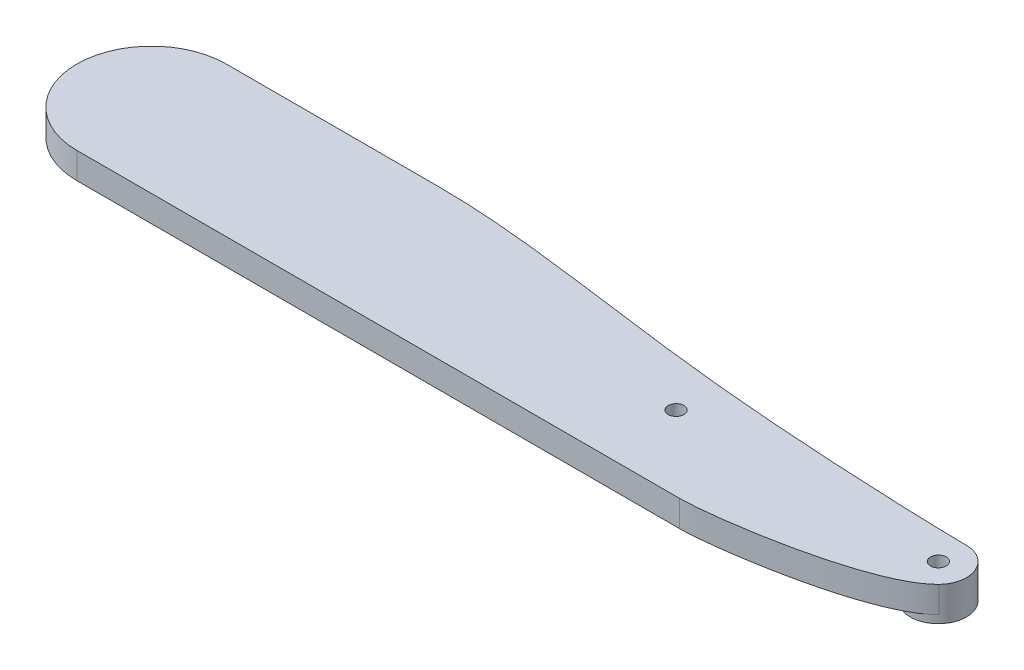
ISO-10303-21;
HEADER;
FILE_DESCRIPTION(('STEP AP214'),'2;1');
FILE_NAME('part.step','',(''),(''),'','','');
FILE_SCHEMA(('AUTOMOTIVE_DESIGN { 1 0 10303 214 1 1 1 1 }'));
ENDSEC;
DATA;
#1=APPLICATION_CONTEXT('core data for automotive mechanical design processes');
#2=APPLICATION_PROTOCOL_DEFINITION('international standard','automotive_design',2000,#1);
#3=PRODUCT_CONTEXT('',#1,'mechanical');
#4=PRODUCT('Part','Part','',(#3));
#5=PRODUCT_RELATED_PRODUCT_CATEGORY('part','',(#4));
#6=PRODUCT_DEFINITION_FORMATION('','',#4);
#7=PRODUCT_DEFINITION_CONTEXT('part definition',#1,'design');
#8=PRODUCT_DEFINITION('design','',#6,#7);
#9=PRODUCT_DEFINITION_SHAPE('','',#8);
#10=(LENGTH_UNIT() NAMED_UNIT(*) SI_UNIT(.MILLI.,.METRE.));
#11=(NAMED_UNIT(*) PLANE_ANGLE_UNIT() SI_UNIT($,.RADIAN.));
#12=(NAMED_UNIT(*) SI_UNIT($,.STERADIAN.) SOLID_ANGLE_UNIT());
#13=UNCERTAINTY_MEASURE_WITH_UNIT(LENGTH_MEASURE(1.E-05),#10,'distance_accuracy_value','');
#14=(GEOMETRIC_REPRESENTATION_CONTEXT(3) GLOBAL_UNCERTAINTY_ASSIGNED_CONTEXT((#13)) GLOBAL_UNIT_ASSIGNED_CONTEXT((#10,
#11,#12)) REPRESENTATION_CONTEXT('',''));
#15=CARTESIAN_POINT('',(0.,0.,0.));
#16=DIRECTION('',(0.,0.,1.));
#17=DIRECTION('',(1.,0.,0.));
#18=AXIS2_PLACEMENT_3D('',#15,#16,#17);
#19=CARTESIAN_POINT('',(-75.,5.,14.25));
#20=DIRECTION('',(0.,0.,-1.));
#21=DIRECTION('',(-1.,0.,0.));
#22=AXIS2_PLACEMENT_3D('',#19,#20,#21);
#23=PLANE('',#22);
#24=DIRECTION('',(0.,-1.,0.));
#25=VECTOR('',#24,1.);
#26=CARTESIAN_POINT('',(39.9337685956905,5.001,14.25));
#27=LINE('',#26,#25);
#28=CARTESIAN_POINT('',(39.9337685956905,5.,14.25));
#29=VERTEX_POINT('',#28);
#30=CARTESIAN_POINT('',(39.9337685956905,0.,14.25));
#31=VERTEX_POINT('',#30);
#32=EDGE_CURVE('E107',#29,#31,#27,.T.);
#33=ORIENTED_EDGE('',*,*,#32,.F.);
#34=DIRECTION('',(1.,0.,0.));
#35=VECTOR('',#34,1.);
#36=CARTESIAN_POINT('',(-75.,5.,14.25));
#37=LINE('',#36,#35);
#38=CARTESIAN_POINT('',(-75.,5.,14.25));
#39=VERTEX_POINT('',#38);
#40=EDGE_CURVE('E99',#39,#29,#37,.T.);
#41=ORIENTED_EDGE('',*,*,#40,.F.);
#42=DIRECTION('',(0.,-1.,0.));
#43=VECTOR('',#42,1.);
#44=CARTESIAN_POINT('',(-75.,5.,14.25));
#45=LINE('',#44,#43);
#46=CARTESIAN_POINT('',(-75.,0.,14.25));
#47=VERTEX_POINT('',#46);
#48=EDGE_CURVE('E47',#39,#47,#45,.T.);
#49=ORIENTED_EDGE('',*,*,#48,.T.);
#50=DIRECTION('',(1.,0.,0.));
#51=VECTOR('',#50,1.);
#52=CARTESIAN_POINT('',(-75.,0.,14.25));
#53=LINE('',#52,#51);
#54=EDGE_CURVE('E90',#47,#31,#53,.T.);
#55=ORIENTED_EDGE('',*,*,#54,.T.);
#56=EDGE_LOOP('',(#33,#41,#49,#55));
#57=FACE_BOUND('',#56,.T.);
#58=ADVANCED_FACE('F39',(#57),#23,.F.);
#59=CARTESIAN_POINT('',(-75.,5.,-14.25));
#60=DIRECTION('',(0.,0.,-1.));
#61=DIRECTION('',(-1.,0.,0.));
#62=AXIS2_PLACEMENT_3D('',#59,#60,#61);
#63=PLANE('',#62);
#64=DIRECTION('',(1.,0.,0.));
#65=VECTOR('',#64,1.);
#66=CARTESIAN_POINT('',(-75.,5.,-14.25));
#67=LINE('',#66,#65);
#68=CARTESIAN_POINT('',(-75.,5.,-14.25));
#69=VERTEX_POINT('',#68);
#70=CARTESIAN_POINT('',(-34.5980224377259,5.,-14.25));
#71=VERTEX_POINT('',#70);
#72=EDGE_CURVE('E81',#69,#71,#67,.T.);
#73=ORIENTED_EDGE('',*,*,#72,.T.);
#74=DIRECTION('',(0.,-1.,0.));
#75=VECTOR('',#74,1.);
#76=CARTESIAN_POINT('',(-34.5980224377259,5.001,-14.25));
#77=LINE('',#76,#75);
#78=CARTESIAN_POINT('',(-34.5980224377259,0.,-14.25));
#79=VERTEX_POINT('',#78);
#80=EDGE_CURVE('E97',#71,#79,#77,.T.);
#81=ORIENTED_EDGE('',*,*,#80,.T.);
#82=DIRECTION('',(1.,0.,0.));
#83=VECTOR('',#82,1.);
#84=CARTESIAN_POINT('',(-75.,0.,-14.25));
#85=LINE('',#84,#83);
#86=CARTESIAN_POINT('',(-75.,0.,-14.25));
#87=VERTEX_POINT('',#86);
#88=EDGE_CURVE('E88',#87,#79,#85,.T.);
#89=ORIENTED_EDGE('',*,*,#88,.F.);
#90=DIRECTION('',(0.,-1.,0.));
#91=VECTOR('',#90,1.);
#92=CARTESIAN_POINT('',(-75.,5.,-14.25));
#93=LINE('',#92,#91);
#94=EDGE_CURVE('E63',#69,#87,#93,.T.);
#95=ORIENTED_EDGE('',*,*,#94,.F.);
#96=EDGE_LOOP('',(#73,#81,#89,#95));
#97=FACE_BOUND('',#96,.T.);
#98=ADVANCED_FACE('F95',(#97),#63,.T.);
#99=CARTESIAN_POINT('',(-75.,0.,0.));
#100=DIRECTION('',(0.,1.,0.));
#101=DIRECTION('',(0.,0.,1.));
#102=AXIS2_PLACEMENT_3D('',#99,#100,#101);
#103=PLANE('',#102);
#104=CARTESIAN_POINT('',(25.,0.,0.));
#105=DIRECTION('',(0.,1.,0.));
#106=DIRECTION('',(0.,0.,1.));
#107=AXIS2_PLACEMENT_3D('',#104,#105,#106);
#108=CIRCLE('',#107,1.5);
#109=CARTESIAN_POINT('',(25.,0.,1.5));
#110=VERTEX_POINT('',#109);
#111=EDGE_CURVE('E92',#110,#110,#108,.T.);
#112=ORIENTED_EDGE('',*,*,#111,.T.);
#113=EDGE_LOOP('',(#112));
#114=FACE_BOUND('',#113,.T.);
#115=CARTESIAN_POINT('',(78.8479561308971,0.,3.71695219429728));
#116=CARTESIAN_POINT('',(76.072393782244,0.,6.5903392054546));
#117=CARTESIAN_POINT('',(61.3499696988219,0.,12.0828531777784));
#118=CARTESIAN_POINT('',(43.7106323264205,0.,14.25));
#119=CARTESIAN_POINT('',(39.9337685956905,0.,14.25));
#120=B_SPLINE_CURVE_WITH_KNOTS('',3,(#115,#116,#117,#118,#119),.UNSPECIFIED.,.F.,.F.,(4,1,4),
(0.,0.424659955547958,1.),.UNSPECIFIED.);
#121=CARTESIAN_POINT('',(78.8479561308971,0.,3.71695219429727));
#122=VERTEX_POINT('',#121);
#123=EDGE_CURVE('E54',#122,#31,#120,.T.);
#124=ORIENTED_EDGE('',*,*,#123,.T.);
#125=ORIENTED_EDGE('',*,*,#54,.F.);
#126=CARTESIAN_POINT('',(-75.,0.,0.));
#127=DIRECTION('',(0.,1.,0.));
#128=DIRECTION('',(0.,0.,1.));
#129=AXIS2_PLACEMENT_3D('',#126,#127,#128);
#130=CIRCLE('',#129,14.25);
#131=EDGE_CURVE('E77',#87,#47,#130,.T.);
#132=ORIENTED_EDGE('',*,*,#131,.F.);
#133=ORIENTED_EDGE('',*,*,#88,.T.);
#134=CARTESIAN_POINT('',(-34.5980224377259,0.,-14.25));
#135=CARTESIAN_POINT('',(-16.7114247665398,0.,-14.25));
#136=CARTESIAN_POINT('',(16.9697721095391,0.,-7.11576395128839));
#137=CARTESIAN_POINT('',(68.5171140852767,0.,-5.35000000000002));
#138=CARTESIAN_POINT('',(75.,0.,-5.35000000000002));
#139=B_SPLINE_CURVE_WITH_KNOTS('',3,(#134,#135,#136,#137,#138),.UNSPECIFIED.,.F.,.F.,(4,1,4),
(0.,0.557363476483602,1.),.UNSPECIFIED.);
#140=CARTESIAN_POINT('',(75.,0.,-5.35000000000002));
#141=VERTEX_POINT('',#140);
#142=EDGE_CURVE('E139',#79,#141,#139,.T.);
#143=ORIENTED_EDGE('',*,*,#142,.T.);
#144=CARTESIAN_POINT('',(75.,0.,0.));
#145=DIRECTION('',(0.,1.,0.));
#146=DIRECTION('',(0.,0.,1.));
#147=AXIS2_PLACEMENT_3D('',#144,#145,#146);
#148=CIRCLE('',#147,5.35);
#149=EDGE_CURVE('E11',#122,#141,#148,.F.);
#150=ORIENTED_EDGE('',*,*,#149,.F.);
#151=EDGE_LOOP('',(#124,#125,#132,#133,#143,#150));
#152=FACE_BOUND('',#151,.T.);
#153=ADVANCED_FACE('F85',(#114,#152),#103,.F.);
#154=CARTESIAN_POINT('',(-75.,5.,0.));
#155=DIRECTION('',(0.,-1.,0.));
#156=DIRECTION('',(0.,0.,-1.));
#157=AXIS2_PLACEMENT_3D('',#154,#155,#156);
#158=CYLINDRICAL_SURFACE('',#157,14.25);
#159=ORIENTED_EDGE('',*,*,#131,.T.);
#160=ORIENTED_EDGE('',*,*,#48,.F.);
#161=CARTESIAN_POINT('',(-75.,5.,0.));
#162=DIRECTION('',(0.,1.,0.));
#163=DIRECTION('',(0.,0.,1.));
#164=AXIS2_PLACEMENT_3D('',#161,#162,#163);
#165=CIRCLE('',#164,14.25);
#166=EDGE_CURVE('E79',#69,#39,#165,.T.);
#167=ORIENTED_EDGE('',*,*,#166,.F.);
#168=ORIENTED_EDGE('',*,*,#94,.T.);
#169=EDGE_LOOP('',(#159,#160,#167,#168));
#170=FACE_BOUND('',#169,.T.);
#171=ADVANCED_FACE('F41',(#170),#158,.T.);
#172=CARTESIAN_POINT('',(-75.,5.,0.));
#173=DIRECTION('',(0.,1.,0.));
#174=DIRECTION('',(0.,0.,1.));
#175=AXIS2_PLACEMENT_3D('',#172,#173,#174);
#176=PLANE('',#175);
#177=ORIENTED_EDGE('',*,*,#40,.T.);
#178=CARTESIAN_POINT('',(78.8479561308971,5.,3.71695219429728));
#179=CARTESIAN_POINT('',(76.072393782244,5.,6.5903392054546));
#180=CARTESIAN_POINT('',(61.3499696988219,5.,12.0828531777784));
#181=CARTESIAN_POINT('',(43.7106323264205,5.,14.25));
#182=CARTESIAN_POINT('',(39.9337685956905,5.,14.25));
#183=B_SPLINE_CURVE_WITH_KNOTS('',3,(#178,#179,#180,#181,#182),.UNSPECIFIED.,.F.,.F.,(4,1,4),
(0.,0.424659955547958,1.),.UNSPECIFIED.);
#184=CARTESIAN_POINT('',(78.8479561308971,5.,3.71695219429727));
#185=VERTEX_POINT('',#184);
#186=EDGE_CURVE('E153',#185,#29,#183,.T.);
#187=ORIENTED_EDGE('',*,*,#186,.F.);
#188=CARTESIAN_POINT('',(75.,5.,0.));
#189=DIRECTION('',(0.,1.,0.));
#190=DIRECTION('',(0.,0.,1.));
#191=AXIS2_PLACEMENT_3D('',#188,#189,#190);
#192=CIRCLE('',#191,5.35);
#193=CARTESIAN_POINT('',(75.,5.,-5.35000000000002));
#194=VERTEX_POINT('',#193);
#195=EDGE_CURVE('E134',#185,#194,#192,.T.);
#196=ORIENTED_EDGE('',*,*,#195,.T.);
#197=CARTESIAN_POINT('',(-34.5980224377259,5.,-14.25));
#198=CARTESIAN_POINT('',(-16.7114247665398,5.,-14.25));
#199=CARTESIAN_POINT('',(16.9697721095391,5.,-7.11576395128839));
#200=CARTESIAN_POINT('',(68.5171140852767,5.,-5.35000000000002));
#201=CARTESIAN_POINT('',(75.,5.,-5.35000000000002));
#202=B_SPLINE_CURVE_WITH_KNOTS('',3,(#197,#198,#199,#200,#201),.UNSPECIFIED.,.F.,.F.,(4,1,4),
(0.,0.557363476483602,1.),.UNSPECIFIED.);
#203=EDGE_CURVE('E117',#71,#194,#202,.T.);
#204=ORIENTED_EDGE('',*,*,#203,.F.);
#205=ORIENTED_EDGE('',*,*,#72,.F.);
#206=ORIENTED_EDGE('',*,*,#166,.T.);
#207=EDGE_LOOP('',(#177,#187,#196,#204,#205,#206));
#208=FACE_BOUND('',#207,.T.);
#209=CARTESIAN_POINT('',(25.,5.,0.));
#210=DIRECTION('',(0.,1.,0.));
#211=DIRECTION('',(0.,0.,1.));
#212=AXIS2_PLACEMENT_3D('',#209,#210,#211);
#213=CIRCLE('',#212,1.5);
#214=CARTESIAN_POINT('',(25.,5.,1.5));
#215=VERTEX_POINT('',#214);
#216=EDGE_CURVE('E123',#215,#215,#213,.T.);
#217=ORIENTED_EDGE('',*,*,#216,.F.);
#218=EDGE_LOOP('',(#217));
#219=FACE_BOUND('',#218,.T.);
#220=CARTESIAN_POINT('',(75.,5.,0.));
#221=DIRECTION('',(0.,1.,0.));
#222=DIRECTION('',(0.,0.,1.));
#223=AXIS2_PLACEMENT_3D('',#220,#221,#222);
#224=CIRCLE('',#223,1.5);
#225=CARTESIAN_POINT('',(75.,5.,1.49999999999997));
#226=VERTEX_POINT('',#225);
#227=EDGE_CURVE('E120',#226,#226,#224,.T.);
#228=ORIENTED_EDGE('',*,*,#227,.F.);
#229=EDGE_LOOP('',(#228));
#230=FACE_BOUND('',#229,.T.);
#231=ADVANCED_FACE('F111',(#208,#219,#230),#176,.T.);
#232=CARTESIAN_POINT('',(75.,0.,0.));
#233=DIRECTION('',(0.,1.,0.));
#234=DIRECTION('',(0.,0.,1.));
#235=AXIS2_PLACEMENT_3D('',#232,#233,#234);
#236=CYLINDRICAL_SURFACE('',#235,1.5);
#237=ORIENTED_EDGE('',*,*,#227,.T.);
#238=EDGE_LOOP('',(#237));
#239=FACE_BOUND('',#238,.T.);
#240=CARTESIAN_POINT('',(75.,-1.5,0.));
#241=DIRECTION('',(0.,-1.,0.));
#242=DIRECTION('',(0.,0.,-1.));
#243=AXIS2_PLACEMENT_3D('',#240,#241,#242);
#244=CIRCLE('',#243,1.5);
#245=CARTESIAN_POINT('',(75.,-1.5,-1.50000000000002));
#246=VERTEX_POINT('',#245);
#247=EDGE_CURVE('E131',#246,#246,#244,.T.);
#248=ORIENTED_EDGE('',*,*,#247,.T.);
#249=EDGE_LOOP('',(#248));
#250=FACE_BOUND('',#249,.T.);
#251=ADVANCED_FACE('F187',(#239,#250),#236,.F.);
#252=CARTESIAN_POINT('',(25.,0.,0.));
#253=DIRECTION('',(0.,1.,0.));
#254=DIRECTION('',(0.,0.,1.));
#255=AXIS2_PLACEMENT_3D('',#252,#253,#254);
#256=CYLINDRICAL_SURFACE('',#255,1.5);
#257=ORIENTED_EDGE('',*,*,#111,.F.);
#258=EDGE_LOOP('',(#257));
#259=FACE_BOUND('',#258,.T.);
#260=ORIENTED_EDGE('',*,*,#216,.T.);
#261=EDGE_LOOP('',(#260));
#262=FACE_BOUND('',#261,.T.);
#263=ADVANCED_FACE('F183',(#259,#262),#256,.F.);
#264=CARTESIAN_POINT('',(75.,-1.5,0.));
#265=DIRECTION('',(0.,1.,0.));
#266=DIRECTION('',(0.,0.,1.));
#267=AXIS2_PLACEMENT_3D('',#264,#265,#266);
#268=CYLINDRICAL_SURFACE('',#267,5.35);
#269=CARTESIAN_POINT('',(75.,-1.5,0.));
#270=DIRECTION('',(0.,-1.,0.));
#271=DIRECTION('',(0.,0.,-1.));
#272=AXIS2_PLACEMENT_3D('',#269,#270,#271);
#273=CIRCLE('',#272,5.35);
#274=CARTESIAN_POINT('',(75.,-1.5,-5.35000000000002));
#275=VERTEX_POINT('',#274);
#276=EDGE_CURVE('E124',#275,#275,#273,.T.);
#277=ORIENTED_EDGE('',*,*,#276,.F.);
#278=EDGE_LOOP('',(#277));
#279=FACE_BOUND('',#278,.T.);
#280=ORIENTED_EDGE('',*,*,#149,.T.);
#281=DIRECTION('',(0.,-1.,0.));
#282=VECTOR('',#281,1.);
#283=CARTESIAN_POINT('',(75.,5.001,-5.35000000000002));
#284=LINE('',#283,#282);
#285=EDGE_CURVE('E138',#194,#141,#284,.T.);
#286=ORIENTED_EDGE('',*,*,#285,.F.);
#287=ORIENTED_EDGE('',*,*,#195,.F.);
#288=DIRECTION('',(0.,-1.,0.));
#289=VECTOR('',#288,1.);
#290=CARTESIAN_POINT('',(78.8479561308971,5.001,3.71695219429727));
#291=LINE('',#290,#289);
#292=EDGE_CURVE('E136',#185,#122,#291,.T.);
#293=ORIENTED_EDGE('',*,*,#292,.T.);
#294=EDGE_LOOP('',(#280,#286,#287,#293));
#295=FACE_BOUND('',#294,.T.);
#296=ADVANCED_FACE('F179',(#279,#295),#268,.T.);
#297=CARTESIAN_POINT('',(75.,-1.5,0.));
#298=DIRECTION('',(0.,-1.,0.));
#299=DIRECTION('',(0.,0.,-1.));
#300=AXIS2_PLACEMENT_3D('',#297,#298,#299);
#301=PLANE('',#300);
#302=ORIENTED_EDGE('',*,*,#247,.F.);
#303=EDGE_LOOP('',(#302));
#304=FACE_BOUND('',#303,.T.);
#305=ORIENTED_EDGE('',*,*,#276,.T.);
#306=EDGE_LOOP('',(#305));
#307=FACE_BOUND('',#306,.T.);
#308=ADVANCED_FACE('F176',(#304,#307),#301,.T.);
#309=CARTESIAN_POINT('',(78.8479561308971,5.001,3.71695219429728));
#310=CARTESIAN_POINT('',(76.072393782244,5.001,6.5903392054546));
#311=CARTESIAN_POINT('',(61.3499696988219,5.001,12.0828531777784));
#312=CARTESIAN_POINT('',(43.7106323264205,5.001,14.25));
#313=CARTESIAN_POINT('',(39.9337685956905,5.001,14.25));
#314=B_SPLINE_CURVE_WITH_KNOTS('',3,(#309,#310,#311,#312,#313),.UNSPECIFIED.,.F.,.F.,(4,1,4),
(0.,0.424659955547958,1.),.UNSPECIFIED.);
#315=DIRECTION('',(0.,-1.,0.));
#316=VECTOR('',#315,1.);
#317=SURFACE_OF_LINEAR_EXTRUSION('',#314,#316);
#318=ORIENTED_EDGE('',*,*,#186,.T.);
#319=ORIENTED_EDGE('',*,*,#32,.T.);
#320=ORIENTED_EDGE('',*,*,#123,.F.);
#321=ORIENTED_EDGE('',*,*,#292,.F.);
#322=EDGE_LOOP('',(#318,#319,#320,#321));
#323=FACE_BOUND('',#322,.T.);
#324=ADVANCED_FACE('F172',(#323),#317,.T.);
#325=CARTESIAN_POINT('',(-34.5980224377259,5.001,-14.25));
#326=CARTESIAN_POINT('',(-16.7114247665398,5.001,-14.25));
#327=CARTESIAN_POINT('',(16.9697721095391,5.001,-7.11576395128839));
#328=CARTESIAN_POINT('',(68.5171140852767,5.001,-5.35000000000002));
#329=CARTESIAN_POINT('',(75.,5.001,-5.35000000000002));
#330=B_SPLINE_CURVE_WITH_KNOTS('',3,(#325,#326,#327,#328,#329),.UNSPECIFIED.,.F.,.F.,(4,1,4),
(0.,0.557363476483602,1.),.UNSPECIFIED.);
#331=DIRECTION('',(0.,-1.,0.));
#332=VECTOR('',#331,1.);
#333=SURFACE_OF_LINEAR_EXTRUSION('',#330,#332);
#334=ORIENTED_EDGE('',*,*,#203,.T.);
#335=ORIENTED_EDGE('',*,*,#285,.T.);
#336=ORIENTED_EDGE('',*,*,#142,.F.);
#337=ORIENTED_EDGE('',*,*,#80,.F.);
#338=EDGE_LOOP('',(#334,#335,#336,#337));
#339=FACE_BOUND('',#338,.T.);
#340=ADVANCED_FACE('F169',(#339),#333,.T.);
#341=CLOSED_SHELL('',(#58,#98,#153,#171,#231,#251,#263,#296,#308,#324,#340));
#342=MANIFOLD_SOLID_BREP('B2',#341);
#343=ADVANCED_BREP_SHAPE_REPRESENTATION('',(#18,#342),#14);
#344=SHAPE_DEFINITION_REPRESENTATION(#9,#343);
ENDSEC;
END-ISO-10303-21;
